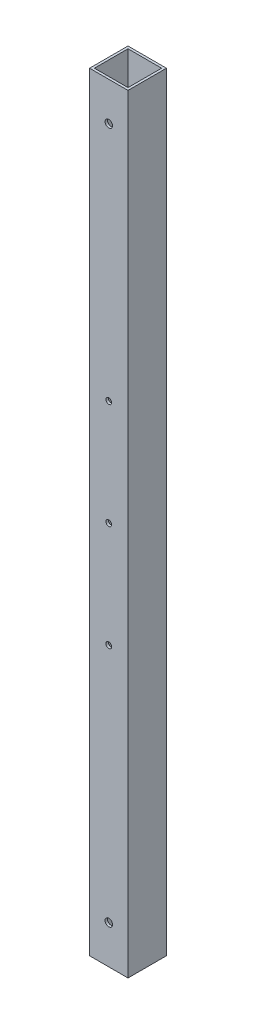
ISO-10303-21;
HEADER;
FILE_DESCRIPTION(('STEP AP214'),'2;1');
FILE_NAME('part.step','',(''),(''),'','','');
FILE_SCHEMA(('AUTOMOTIVE_DESIGN { 1 0 10303 214 1 1 1 1 }'));
ENDSEC;
DATA;
#1=APPLICATION_CONTEXT('core data for automotive mechanical design processes');
#2=APPLICATION_PROTOCOL_DEFINITION('international standard','automotive_design',2000,#1);
#3=PRODUCT_CONTEXT('',#1,'mechanical');
#4=PRODUCT('Part','Part','',(#3));
#5=PRODUCT_RELATED_PRODUCT_CATEGORY('part','',(#4));
#6=PRODUCT_DEFINITION_FORMATION('','',#4);
#7=PRODUCT_DEFINITION_CONTEXT('part definition',#1,'design');
#8=PRODUCT_DEFINITION('design','',#6,#7);
#9=PRODUCT_DEFINITION_SHAPE('','',#8);
#10=(LENGTH_UNIT() NAMED_UNIT(*) SI_UNIT(.MILLI.,.METRE.));
#11=(NAMED_UNIT(*) PLANE_ANGLE_UNIT() SI_UNIT($,.RADIAN.));
#12=(NAMED_UNIT(*) SI_UNIT($,.STERADIAN.) SOLID_ANGLE_UNIT());
#13=UNCERTAINTY_MEASURE_WITH_UNIT(LENGTH_MEASURE(1.E-05),#10,'distance_accuracy_value','');
#14=(GEOMETRIC_REPRESENTATION_CONTEXT(3) GLOBAL_UNCERTAINTY_ASSIGNED_CONTEXT((#13)) GLOBAL_UNIT_ASSIGNED_CONTEXT((#10,
#11,#12)) REPRESENTATION_CONTEXT('',''));
#15=CARTESIAN_POINT('',(0.,0.,0.));
#16=DIRECTION('',(0.,0.,1.));
#17=DIRECTION('',(1.,0.,0.));
#18=AXIS2_PLACEMENT_3D('',#15,#16,#17);
#19=CARTESIAN_POINT('',(0.,254.,0.));
#20=DIRECTION('',(0.,1.,0.));
#21=DIRECTION('',(0.,0.,1.));
#22=AXIS2_PLACEMENT_3D('',#19,#20,#21);
#23=PLANE('',#22);
#24=DIRECTION('',(0.,0.,1.));
#25=VECTOR('',#24,1.);
#26=CARTESIAN_POINT('',(-12.7,254.,12.7));
#27=LINE('',#26,#25);
#28=CARTESIAN_POINT('',(-12.7,254.,-12.7));
#29=VERTEX_POINT('',#28);
#30=CARTESIAN_POINT('',(-12.7,254.,12.7));
#31=VERTEX_POINT('',#30);
#32=EDGE_CURVE('E137',#29,#31,#27,.T.);
#33=ORIENTED_EDGE('',*,*,#32,.T.);
#34=DIRECTION('',(1.,0.,0.));
#35=VECTOR('',#34,1.);
#36=CARTESIAN_POINT('',(12.7,254.,12.7));
#37=LINE('',#36,#35);
#38=CARTESIAN_POINT('',(12.7,254.,12.7));
#39=VERTEX_POINT('',#38);
#40=EDGE_CURVE('E140',#31,#39,#37,.T.);
#41=ORIENTED_EDGE('',*,*,#40,.T.);
#42=DIRECTION('',(0.,0.,-1.));
#43=VECTOR('',#42,1.);
#44=CARTESIAN_POINT('',(12.7,254.,12.7));
#45=LINE('',#44,#43);
#46=CARTESIAN_POINT('',(12.7,254.,-12.7));
#47=VERTEX_POINT('',#46);
#48=EDGE_CURVE('E143',#39,#47,#45,.T.);
#49=ORIENTED_EDGE('',*,*,#48,.T.);
#50=DIRECTION('',(-1.,0.,0.));
#51=VECTOR('',#50,1.);
#52=CARTESIAN_POINT('',(12.7,254.,-12.7));
#53=LINE('',#52,#51);
#54=EDGE_CURVE('E145',#47,#29,#53,.T.);
#55=ORIENTED_EDGE('',*,*,#54,.T.);
#56=EDGE_LOOP('',(#33,#41,#49,#55));
#57=FACE_BOUND('',#56,.T.);
#58=DIRECTION('',(-1.,0.,0.));
#59=VECTOR('',#58,1.);
#60=CARTESIAN_POINT('',(11.1125,254.,-11.1125));
#61=LINE('',#60,#59);
#62=CARTESIAN_POINT('',(11.1125,254.,-11.1125));
#63=VERTEX_POINT('',#62);
#64=CARTESIAN_POINT('',(-11.1125,254.,-11.1125));
#65=VERTEX_POINT('',#64);
#66=EDGE_CURVE('E107',#63,#65,#61,.T.);
#67=ORIENTED_EDGE('',*,*,#66,.F.);
#68=DIRECTION('',(0.,0.,-1.));
#69=VECTOR('',#68,1.);
#70=CARTESIAN_POINT('',(11.1125,254.,11.1125));
#71=LINE('',#70,#69);
#72=CARTESIAN_POINT('',(11.1125,254.,11.1125));
#73=VERTEX_POINT('',#72);
#74=EDGE_CURVE('E99',#73,#63,#71,.T.);
#75=ORIENTED_EDGE('',*,*,#74,.F.);
#76=DIRECTION('',(1.,0.,0.));
#77=VECTOR('',#76,1.);
#78=CARTESIAN_POINT('',(11.1125,254.,11.1125));
#79=LINE('',#78,#77);
#80=CARTESIAN_POINT('',(-11.1125,254.,11.1125));
#81=VERTEX_POINT('',#80);
#82=EDGE_CURVE('E121',#81,#73,#79,.T.);
#83=ORIENTED_EDGE('',*,*,#82,.F.);
#84=DIRECTION('',(0.,0.,1.));
#85=VECTOR('',#84,1.);
#86=CARTESIAN_POINT('',(-11.1125,254.,11.1125));
#87=LINE('',#86,#85);
#88=EDGE_CURVE('E119',#65,#81,#87,.T.);
#89=ORIENTED_EDGE('',*,*,#88,.F.);
#90=EDGE_LOOP('',(#67,#75,#83,#89));
#91=FACE_BOUND('',#90,.T.);
#92=ADVANCED_FACE('F32',(#57,#91),#23,.T.);
#93=CARTESIAN_POINT('',(0.,-254.,0.));
#94=DIRECTION('',(0.,1.,0.));
#95=DIRECTION('',(0.,0.,1.));
#96=AXIS2_PLACEMENT_3D('',#93,#94,#95);
#97=PLANE('',#96);
#98=DIRECTION('',(0.,0.,1.));
#99=VECTOR('',#98,1.);
#100=CARTESIAN_POINT('',(-12.7,-254.,12.7));
#101=LINE('',#100,#99);
#102=CARTESIAN_POINT('',(-12.7,-254.,-12.7));
#103=VERTEX_POINT('',#102);
#104=CARTESIAN_POINT('',(-12.7,-254.,12.7));
#105=VERTEX_POINT('',#104);
#106=EDGE_CURVE('E115',#103,#105,#101,.T.);
#107=ORIENTED_EDGE('',*,*,#106,.F.);
#108=DIRECTION('',(-1.,0.,0.));
#109=VECTOR('',#108,1.);
#110=CARTESIAN_POINT('',(12.7,-254.,-12.7));
#111=LINE('',#110,#109);
#112=CARTESIAN_POINT('',(12.7,-254.,-12.7));
#113=VERTEX_POINT('',#112);
#114=EDGE_CURVE('E141',#113,#103,#111,.T.);
#115=ORIENTED_EDGE('',*,*,#114,.F.);
#116=DIRECTION('',(0.,0.,-1.));
#117=VECTOR('',#116,1.);
#118=CARTESIAN_POINT('',(12.7,-254.,12.7));
#119=LINE('',#118,#117);
#120=CARTESIAN_POINT('',(12.7,-254.,12.7));
#121=VERTEX_POINT('',#120);
#122=EDGE_CURVE('E152',#121,#113,#119,.T.);
#123=ORIENTED_EDGE('',*,*,#122,.F.);
#124=DIRECTION('',(1.,0.,0.));
#125=VECTOR('',#124,1.);
#126=CARTESIAN_POINT('',(12.7,-254.,12.7));
#127=LINE('',#126,#125);
#128=EDGE_CURVE('E150',#105,#121,#127,.T.);
#129=ORIENTED_EDGE('',*,*,#128,.F.);
#130=EDGE_LOOP('',(#107,#115,#123,#129));
#131=FACE_BOUND('',#130,.T.);
#132=DIRECTION('',(0.,0.,-1.));
#133=VECTOR('',#132,1.);
#134=CARTESIAN_POINT('',(11.1125,-254.,11.1125));
#135=LINE('',#134,#133);
#136=CARTESIAN_POINT('',(11.1125,-254.,11.1125));
#137=VERTEX_POINT('',#136);
#138=CARTESIAN_POINT('',(11.1125,-254.,-11.1125));
#139=VERTEX_POINT('',#138);
#140=EDGE_CURVE('E57',#137,#139,#135,.T.);
#141=ORIENTED_EDGE('',*,*,#140,.T.);
#142=DIRECTION('',(-1.,0.,0.));
#143=VECTOR('',#142,1.);
#144=CARTESIAN_POINT('',(11.1125,-254.,-11.1125));
#145=LINE('',#144,#143);
#146=CARTESIAN_POINT('',(-11.1125,-254.,-11.1125));
#147=VERTEX_POINT('',#146);
#148=EDGE_CURVE('E114',#139,#147,#145,.T.);
#149=ORIENTED_EDGE('',*,*,#148,.T.);
#150=DIRECTION('',(0.,0.,1.));
#151=VECTOR('',#150,1.);
#152=CARTESIAN_POINT('',(-11.1125,-254.,11.1125));
#153=LINE('',#152,#151);
#154=CARTESIAN_POINT('',(-11.1125,-254.,11.1125));
#155=VERTEX_POINT('',#154);
#156=EDGE_CURVE('E129',#147,#155,#153,.T.);
#157=ORIENTED_EDGE('',*,*,#156,.T.);
#158=DIRECTION('',(1.,0.,0.));
#159=VECTOR('',#158,1.);
#160=CARTESIAN_POINT('',(11.1125,-254.,11.1125));
#161=LINE('',#160,#159);
#162=EDGE_CURVE('E108',#155,#137,#161,.T.);
#163=ORIENTED_EDGE('',*,*,#162,.T.);
#164=EDGE_LOOP('',(#141,#149,#157,#163));
#165=FACE_BOUND('',#164,.T.);
#166=ADVANCED_FACE('F236',(#131,#165),#97,.F.);
#167=CARTESIAN_POINT('',(-12.7,254.,12.7));
#168=DIRECTION('',(1.,0.,0.));
#169=DIRECTION('',(0.,0.,-1.));
#170=AXIS2_PLACEMENT_3D('',#167,#168,#169);
#171=PLANE('',#170);
#172=ORIENTED_EDGE('',*,*,#106,.T.);
#173=DIRECTION('',(0.,-1.,0.));
#174=VECTOR('',#173,1.);
#175=CARTESIAN_POINT('',(-12.7,254.,12.7));
#176=LINE('',#175,#174);
#177=EDGE_CURVE('E11',#31,#105,#176,.T.);
#178=ORIENTED_EDGE('',*,*,#177,.F.);
#179=ORIENTED_EDGE('',*,*,#32,.F.);
#180=DIRECTION('',(0.,-1.,0.));
#181=VECTOR('',#180,1.);
#182=CARTESIAN_POINT('',(-12.7,254.,-12.7));
#183=LINE('',#182,#181);
#184=EDGE_CURVE('E147',#29,#103,#183,.T.);
#185=ORIENTED_EDGE('',*,*,#184,.T.);
#186=EDGE_LOOP('',(#172,#178,#179,#185));
#187=FACE_BOUND('',#186,.T.);
#188=ADVANCED_FACE('F34',(#187),#171,.F.);
#189=CARTESIAN_POINT('',(12.7,254.,12.7));
#190=DIRECTION('',(0.,0.,-1.));
#191=DIRECTION('',(-1.,0.,0.));
#192=AXIS2_PLACEMENT_3D('',#189,#190,#191);
#193=PLANE('',#192);
#194=CARTESIAN_POINT('',(-4.84811459262744E-13,69.85,12.7));
#195=DIRECTION('',(0.,0.,1.));
#196=DIRECTION('',(1.,0.,0.));
#197=AXIS2_PLACEMENT_3D('',#194,#195,#196);
#198=CIRCLE('',#197,1.90499999999999);
#199=CARTESIAN_POINT('',(1.90499999999951,69.85,12.7));
#200=VERTEX_POINT('',#199);
#201=EDGE_CURVE('E264',#200,#200,#198,.T.);
#202=ORIENTED_EDGE('',*,*,#201,.F.);
#203=EDGE_LOOP('',(#202));
#204=FACE_BOUND('',#203,.T.);
#205=CARTESIAN_POINT('',(-2.40931487744551E-13,0.,12.7));
#206=DIRECTION('',(0.,0.,1.));
#207=DIRECTION('',(1.,0.,0.));
#208=AXIS2_PLACEMENT_3D('',#205,#206,#207);
#209=CIRCLE('',#208,1.90499999999999);
#210=CARTESIAN_POINT('',(1.90499999999975,0.,12.7));
#211=VERTEX_POINT('',#210);
#212=EDGE_CURVE('E186',#211,#211,#209,.T.);
#213=ORIENTED_EDGE('',*,*,#212,.F.);
#214=EDGE_LOOP('',(#213));
#215=FACE_BOUND('',#214,.T.);
#216=CARTESIAN_POINT('',(0.,-69.85,12.7));
#217=DIRECTION('',(0.,0.,1.));
#218=DIRECTION('',(1.,0.,0.));
#219=AXIS2_PLACEMENT_3D('',#216,#217,#218);
#220=CIRCLE('',#219,1.90499999999999);
#221=CARTESIAN_POINT('',(1.905,-69.85,12.7));
#222=VERTEX_POINT('',#221);
#223=EDGE_CURVE('E183',#222,#222,#220,.T.);
#224=ORIENTED_EDGE('',*,*,#223,.F.);
#225=EDGE_LOOP('',(#224));
#226=FACE_BOUND('',#225,.T.);
#227=CARTESIAN_POINT('',(0.,228.6,12.7));
#228=DIRECTION('',(0.,0.,-1.));
#229=DIRECTION('',(-1.,0.,0.));
#230=AXIS2_PLACEMENT_3D('',#227,#228,#229);
#231=CIRCLE('',#230,2.45744999999999);
#232=CARTESIAN_POINT('',(-2.45744999999999,228.6,12.7));
#233=VERTEX_POINT('',#232);
#234=EDGE_CURVE('E206',#233,#233,#231,.T.);
#235=ORIENTED_EDGE('',*,*,#234,.T.);
#236=EDGE_LOOP('',(#235));
#237=FACE_BOUND('',#236,.T.);
#238=CARTESIAN_POINT('',(0.,-228.6,12.7));
#239=DIRECTION('',(0.,0.,-1.));
#240=DIRECTION('',(-1.,0.,0.));
#241=AXIS2_PLACEMENT_3D('',#238,#239,#240);
#242=CIRCLE('',#241,2.45744999999999);
#243=CARTESIAN_POINT('',(-2.45744999999999,-228.6,12.7));
#244=VERTEX_POINT('',#243);
#245=EDGE_CURVE('E127',#244,#244,#242,.T.);
#246=ORIENTED_EDGE('',*,*,#245,.T.);
#247=EDGE_LOOP('',(#246));
#248=FACE_BOUND('',#247,.T.);
#249=ORIENTED_EDGE('',*,*,#128,.T.);
#250=DIRECTION('',(0.,-1.,0.));
#251=VECTOR('',#250,1.);
#252=CARTESIAN_POINT('',(12.7,254.,12.7));
#253=LINE('',#252,#251);
#254=EDGE_CURVE('E41',#39,#121,#253,.T.);
#255=ORIENTED_EDGE('',*,*,#254,.F.);
#256=ORIENTED_EDGE('',*,*,#40,.F.);
#257=ORIENTED_EDGE('',*,*,#177,.T.);
#258=EDGE_LOOP('',(#249,#255,#256,#257));
#259=FACE_BOUND('',#258,.T.);
#260=ADVANCED_FACE('F215',(#204,#215,#226,#237,#248,#259),#193,.F.);
#261=CARTESIAN_POINT('',(12.7,254.,12.7));
#262=DIRECTION('',(-1.,0.,0.));
#263=DIRECTION('',(0.,0.,1.));
#264=AXIS2_PLACEMENT_3D('',#261,#262,#263);
#265=PLANE('',#264);
#266=ORIENTED_EDGE('',*,*,#122,.T.);
#267=DIRECTION('',(0.,-1.,0.));
#268=VECTOR('',#267,1.);
#269=CARTESIAN_POINT('',(12.7,254.,-12.7));
#270=LINE('',#269,#268);
#271=EDGE_CURVE('E157',#47,#113,#270,.T.);
#272=ORIENTED_EDGE('',*,*,#271,.F.);
#273=ORIENTED_EDGE('',*,*,#48,.F.);
#274=ORIENTED_EDGE('',*,*,#254,.T.);
#275=EDGE_LOOP('',(#266,#272,#273,#274));
#276=FACE_BOUND('',#275,.T.);
#277=ADVANCED_FACE('F250',(#276),#265,.F.);
#278=CARTESIAN_POINT('',(12.7,254.,-12.7));
#279=DIRECTION('',(0.,0.,1.));
#280=DIRECTION('',(1.,0.,0.));
#281=AXIS2_PLACEMENT_3D('',#278,#279,#280);
#282=PLANE('',#281);
#283=CARTESIAN_POINT('',(-4.84811459262744E-13,69.85,-12.7));
#284=DIRECTION('',(0.,0.,1.));
#285=DIRECTION('',(1.,0.,0.));
#286=AXIS2_PLACEMENT_3D('',#283,#284,#285);
#287=CIRCLE('',#286,1.90499999999999);
#288=CARTESIAN_POINT('',(1.90499999999951,69.85,-12.7));
#289=VERTEX_POINT('',#288);
#290=EDGE_CURVE('E301',#289,#289,#287,.T.);
#291=ORIENTED_EDGE('',*,*,#290,.T.);
#292=EDGE_LOOP('',(#291));
#293=FACE_BOUND('',#292,.T.);
#294=CARTESIAN_POINT('',(-2.40931487744551E-13,0.,-12.7));
#295=DIRECTION('',(0.,0.,1.));
#296=DIRECTION('',(1.,0.,0.));
#297=AXIS2_PLACEMENT_3D('',#294,#295,#296);
#298=CIRCLE('',#297,1.90499999999999);
#299=CARTESIAN_POINT('',(1.90499999999975,0.,-12.7));
#300=VERTEX_POINT('',#299);
#301=EDGE_CURVE('E179',#300,#300,#298,.T.);
#302=ORIENTED_EDGE('',*,*,#301,.T.);
#303=EDGE_LOOP('',(#302));
#304=FACE_BOUND('',#303,.T.);
#305=CARTESIAN_POINT('',(0.,-69.85,-12.7));
#306=DIRECTION('',(0.,0.,1.));
#307=DIRECTION('',(1.,0.,0.));
#308=AXIS2_PLACEMENT_3D('',#305,#306,#307);
#309=CIRCLE('',#308,1.90499999999999);
#310=CARTESIAN_POINT('',(1.905,-69.85,-12.7));
#311=VERTEX_POINT('',#310);
#312=EDGE_CURVE('E175',#311,#311,#309,.T.);
#313=ORIENTED_EDGE('',*,*,#312,.T.);
#314=EDGE_LOOP('',(#313));
#315=FACE_BOUND('',#314,.T.);
#316=CARTESIAN_POINT('',(0.,228.6,-12.7));
#317=DIRECTION('',(0.,0.,-1.));
#318=DIRECTION('',(-1.,0.,0.));
#319=AXIS2_PLACEMENT_3D('',#316,#317,#318);
#320=CIRCLE('',#319,2.45744999999999);
#321=CARTESIAN_POINT('',(-2.45744999999999,228.6,-12.7));
#322=VERTEX_POINT('',#321);
#323=EDGE_CURVE('E171',#322,#322,#320,.T.);
#324=ORIENTED_EDGE('',*,*,#323,.F.);
#325=EDGE_LOOP('',(#324));
#326=FACE_BOUND('',#325,.T.);
#327=CARTESIAN_POINT('',(0.,-228.6,-12.7));
#328=DIRECTION('',(0.,0.,-1.));
#329=DIRECTION('',(-1.,0.,0.));
#330=AXIS2_PLACEMENT_3D('',#327,#328,#329);
#331=CIRCLE('',#330,2.45744999999999);
#332=CARTESIAN_POINT('',(-2.45744999999999,-228.6,-12.7));
#333=VERTEX_POINT('',#332);
#334=EDGE_CURVE('E166',#333,#333,#331,.T.);
#335=ORIENTED_EDGE('',*,*,#334,.F.);
#336=EDGE_LOOP('',(#335));
#337=FACE_BOUND('',#336,.T.);
#338=ORIENTED_EDGE('',*,*,#114,.T.);
#339=ORIENTED_EDGE('',*,*,#184,.F.);
#340=ORIENTED_EDGE('',*,*,#54,.F.);
#341=ORIENTED_EDGE('',*,*,#271,.T.);
#342=EDGE_LOOP('',(#338,#339,#340,#341));
#343=FACE_BOUND('',#342,.T.);
#344=ADVANCED_FACE('F247',(#293,#304,#315,#326,#337,#343),#282,.F.);
#345=CARTESIAN_POINT('',(11.1125,254.,11.1125));
#346=DIRECTION('',(-1.,0.,0.));
#347=DIRECTION('',(0.,0.,1.));
#348=AXIS2_PLACEMENT_3D('',#345,#346,#347);
#349=PLANE('',#348);
#350=ORIENTED_EDGE('',*,*,#140,.F.);
#351=DIRECTION('',(0.,-1.,0.));
#352=VECTOR('',#351,1.);
#353=CARTESIAN_POINT('',(11.1125,254.,11.1125));
#354=LINE('',#353,#352);
#355=EDGE_CURVE('E103',#73,#137,#354,.T.);
#356=ORIENTED_EDGE('',*,*,#355,.F.);
#357=ORIENTED_EDGE('',*,*,#74,.T.);
#358=DIRECTION('',(0.,-1.,0.));
#359=VECTOR('',#358,1.);
#360=CARTESIAN_POINT('',(11.1125,254.,-11.1125));
#361=LINE('',#360,#359);
#362=EDGE_CURVE('E102',#63,#139,#361,.T.);
#363=ORIENTED_EDGE('',*,*,#362,.T.);
#364=EDGE_LOOP('',(#350,#356,#357,#363));
#365=FACE_BOUND('',#364,.T.);
#366=ADVANCED_FACE('F101',(#365),#349,.T.);
#367=CARTESIAN_POINT('',(11.1125,254.,-11.1125));
#368=DIRECTION('',(0.,0.,1.));
#369=DIRECTION('',(1.,0.,0.));
#370=AXIS2_PLACEMENT_3D('',#367,#368,#369);
#371=PLANE('',#370);
#372=CARTESIAN_POINT('',(-4.84811459262744E-13,69.85,-11.1125));
#373=DIRECTION('',(0.,0.,1.));
#374=DIRECTION('',(1.,0.,0.));
#375=AXIS2_PLACEMENT_3D('',#372,#373,#374);
#376=CIRCLE('',#375,1.90499999999999);
#377=CARTESIAN_POINT('',(1.90499999999951,69.85,-11.1125));
#378=VERTEX_POINT('',#377);
#379=EDGE_CURVE('E191',#378,#378,#376,.T.);
#380=ORIENTED_EDGE('',*,*,#379,.F.);
#381=EDGE_LOOP('',(#380));
#382=FACE_BOUND('',#381,.T.);
#383=CARTESIAN_POINT('',(-2.40931487744551E-13,0.,-11.1125));
#384=DIRECTION('',(0.,0.,1.));
#385=DIRECTION('',(1.,0.,0.));
#386=AXIS2_PLACEMENT_3D('',#383,#384,#385);
#387=CIRCLE('',#386,1.90499999999999);
#388=CARTESIAN_POINT('',(1.90499999999975,0.,-11.1125));
#389=VERTEX_POINT('',#388);
#390=EDGE_CURVE('E178',#389,#389,#387,.T.);
#391=ORIENTED_EDGE('',*,*,#390,.F.);
#392=EDGE_LOOP('',(#391));
#393=FACE_BOUND('',#392,.T.);
#394=CARTESIAN_POINT('',(0.,-69.85,-11.1125));
#395=DIRECTION('',(0.,0.,1.));
#396=DIRECTION('',(1.,0.,0.));
#397=AXIS2_PLACEMENT_3D('',#394,#395,#396);
#398=CIRCLE('',#397,1.90499999999999);
#399=CARTESIAN_POINT('',(1.905,-69.85,-11.1125));
#400=VERTEX_POINT('',#399);
#401=EDGE_CURVE('E174',#400,#400,#398,.T.);
#402=ORIENTED_EDGE('',*,*,#401,.F.);
#403=EDGE_LOOP('',(#402));
#404=FACE_BOUND('',#403,.T.);
#405=CARTESIAN_POINT('',(0.,228.6,-11.1125));
#406=DIRECTION('',(0.,0.,1.));
#407=DIRECTION('',(1.,0.,0.));
#408=AXIS2_PLACEMENT_3D('',#405,#406,#407);
#409=CIRCLE('',#408,2.45744999999999);
#410=CARTESIAN_POINT('',(2.45744999999999,228.6,-11.1125));
#411=VERTEX_POINT('',#410);
#412=EDGE_CURVE('E170',#411,#411,#409,.T.);
#413=ORIENTED_EDGE('',*,*,#412,.F.);
#414=EDGE_LOOP('',(#413));
#415=FACE_BOUND('',#414,.T.);
#416=CARTESIAN_POINT('',(0.,-228.6,-11.1125));
#417=DIRECTION('',(0.,0.,1.));
#418=DIRECTION('',(1.,0.,0.));
#419=AXIS2_PLACEMENT_3D('',#416,#417,#418);
#420=CIRCLE('',#419,2.45744999999999);
#421=CARTESIAN_POINT('',(2.45744999999999,-228.6,-11.1125));
#422=VERTEX_POINT('',#421);
#423=EDGE_CURVE('E165',#422,#422,#420,.T.);
#424=ORIENTED_EDGE('',*,*,#423,.F.);
#425=EDGE_LOOP('',(#424));
#426=FACE_BOUND('',#425,.T.);
#427=ORIENTED_EDGE('',*,*,#148,.F.);
#428=ORIENTED_EDGE('',*,*,#362,.F.);
#429=ORIENTED_EDGE('',*,*,#66,.T.);
#430=DIRECTION('',(0.,-1.,0.));
#431=VECTOR('',#430,1.);
#432=CARTESIAN_POINT('',(-11.1125,254.,-11.1125));
#433=LINE('',#432,#431);
#434=EDGE_CURVE('E116',#65,#147,#433,.T.);
#435=ORIENTED_EDGE('',*,*,#434,.T.);
#436=EDGE_LOOP('',(#427,#428,#429,#435));
#437=FACE_BOUND('',#436,.T.);
#438=ADVANCED_FACE('F111',(#382,#393,#404,#415,#426,#437),#371,.T.);
#439=CARTESIAN_POINT('',(-11.1125,254.,11.1125));
#440=DIRECTION('',(1.,0.,0.));
#441=DIRECTION('',(0.,0.,-1.));
#442=AXIS2_PLACEMENT_3D('',#439,#440,#441);
#443=PLANE('',#442);
#444=ORIENTED_EDGE('',*,*,#156,.F.);
#445=ORIENTED_EDGE('',*,*,#434,.F.);
#446=ORIENTED_EDGE('',*,*,#88,.T.);
#447=DIRECTION('',(0.,-1.,0.));
#448=VECTOR('',#447,1.);
#449=CARTESIAN_POINT('',(-11.1125,254.,11.1125));
#450=LINE('',#449,#448);
#451=EDGE_CURVE('E49',#81,#155,#450,.T.);
#452=ORIENTED_EDGE('',*,*,#451,.T.);
#453=EDGE_LOOP('',(#444,#445,#446,#452));
#454=FACE_BOUND('',#453,.T.);
#455=ADVANCED_FACE('F231',(#454),#443,.T.);
#456=CARTESIAN_POINT('',(11.1125,254.,11.1125));
#457=DIRECTION('',(0.,0.,-1.));
#458=DIRECTION('',(-1.,0.,0.));
#459=AXIS2_PLACEMENT_3D('',#456,#457,#458);
#460=PLANE('',#459);
#461=CARTESIAN_POINT('',(-4.84811459262744E-13,69.85,11.1125));
#462=DIRECTION('',(0.,0.,-1.));
#463=DIRECTION('',(-1.,0.,0.));
#464=AXIS2_PLACEMENT_3D('',#461,#462,#463);
#465=CIRCLE('',#464,1.90499999999999);
#466=CARTESIAN_POINT('',(-1.90500000000048,69.85,11.1125));
#467=VERTEX_POINT('',#466);
#468=EDGE_CURVE('E36',#467,#467,#465,.T.);
#469=ORIENTED_EDGE('',*,*,#468,.F.);
#470=EDGE_LOOP('',(#469));
#471=FACE_BOUND('',#470,.T.);
#472=CARTESIAN_POINT('',(-2.40931487744551E-13,0.,11.1125));
#473=DIRECTION('',(0.,0.,-1.));
#474=DIRECTION('',(-1.,0.,0.));
#475=AXIS2_PLACEMENT_3D('',#472,#473,#474);
#476=CIRCLE('',#475,1.90499999999999);
#477=CARTESIAN_POINT('',(-1.90500000000024,0.,11.1125));
#478=VERTEX_POINT('',#477);
#479=EDGE_CURVE('E176',#478,#478,#476,.T.);
#480=ORIENTED_EDGE('',*,*,#479,.F.);
#481=EDGE_LOOP('',(#480));
#482=FACE_BOUND('',#481,.T.);
#483=CARTESIAN_POINT('',(0.,-69.85,11.1125));
#484=DIRECTION('',(0.,0.,-1.));
#485=DIRECTION('',(-1.,0.,0.));
#486=AXIS2_PLACEMENT_3D('',#483,#484,#485);
#487=CIRCLE('',#486,1.90499999999999);
#488=CARTESIAN_POINT('',(-1.90499999999999,-69.85,11.1125));
#489=VERTEX_POINT('',#488);
#490=EDGE_CURVE('E172',#489,#489,#487,.T.);
#491=ORIENTED_EDGE('',*,*,#490,.F.);
#492=EDGE_LOOP('',(#491));
#493=FACE_BOUND('',#492,.T.);
#494=CARTESIAN_POINT('',(0.,228.6,11.1125));
#495=DIRECTION('',(0.,0.,-1.));
#496=DIRECTION('',(-1.,0.,0.));
#497=AXIS2_PLACEMENT_3D('',#494,#495,#496);
#498=CIRCLE('',#497,2.45744999999999);
#499=CARTESIAN_POINT('',(-2.45744999999999,228.6,11.1125));
#500=VERTEX_POINT('',#499);
#501=EDGE_CURVE('E167',#500,#500,#498,.T.);
#502=ORIENTED_EDGE('',*,*,#501,.F.);
#503=EDGE_LOOP('',(#502));
#504=FACE_BOUND('',#503,.T.);
#505=CARTESIAN_POINT('',(0.,-228.6,11.1125));
#506=DIRECTION('',(0.,0.,-1.));
#507=DIRECTION('',(-1.,0.,0.));
#508=AXIS2_PLACEMENT_3D('',#505,#506,#507);
#509=CIRCLE('',#508,2.45744999999999);
#510=CARTESIAN_POINT('',(-2.45744999999999,-228.6,11.1125));
#511=VERTEX_POINT('',#510);
#512=EDGE_CURVE('E162',#511,#511,#509,.T.);
#513=ORIENTED_EDGE('',*,*,#512,.F.);
#514=EDGE_LOOP('',(#513));
#515=FACE_BOUND('',#514,.T.);
#516=ORIENTED_EDGE('',*,*,#162,.F.);
#517=ORIENTED_EDGE('',*,*,#451,.F.);
#518=ORIENTED_EDGE('',*,*,#82,.T.);
#519=ORIENTED_EDGE('',*,*,#355,.T.);
#520=EDGE_LOOP('',(#516,#517,#518,#519));
#521=FACE_BOUND('',#520,.T.);
#522=ADVANCED_FACE('F221',(#471,#482,#493,#504,#515,#521),#460,.T.);
#523=CARTESIAN_POINT('',(0.,-228.6,-12.7));
#524=DIRECTION('',(0.,0.,-1.));
#525=DIRECTION('',(-1.,0.,0.));
#526=AXIS2_PLACEMENT_3D('',#523,#524,#525);
#527=CYLINDRICAL_SURFACE('',#526,2.45744999999999);
#528=ORIENTED_EDGE('',*,*,#512,.T.);
#529=EDGE_LOOP('',(#528));
#530=FACE_BOUND('',#529,.T.);
#531=ORIENTED_EDGE('',*,*,#245,.F.);
#532=EDGE_LOOP('',(#531));
#533=FACE_BOUND('',#532,.T.);
#534=ADVANCED_FACE('F218',(#530,#533),#527,.F.);
#535=ORIENTED_EDGE('',*,*,#423,.T.);
#536=EDGE_LOOP('',(#535));
#537=FACE_BOUND('',#536,.T.);
#538=ORIENTED_EDGE('',*,*,#334,.T.);
#539=EDGE_LOOP('',(#538));
#540=FACE_BOUND('',#539,.T.);
#541=ADVANCED_FACE('F220',(#537,#540),#527,.F.);
#542=CARTESIAN_POINT('',(0.,228.6,-12.7));
#543=DIRECTION('',(0.,0.,-1.));
#544=DIRECTION('',(-1.,0.,0.));
#545=AXIS2_PLACEMENT_3D('',#542,#543,#544);
#546=CYLINDRICAL_SURFACE('',#545,2.45744999999999);
#547=ORIENTED_EDGE('',*,*,#501,.T.);
#548=EDGE_LOOP('',(#547));
#549=FACE_BOUND('',#548,.T.);
#550=ORIENTED_EDGE('',*,*,#234,.F.);
#551=EDGE_LOOP('',(#550));
#552=FACE_BOUND('',#551,.T.);
#553=ADVANCED_FACE('F228',(#549,#552),#546,.F.);
#554=ORIENTED_EDGE('',*,*,#412,.T.);
#555=EDGE_LOOP('',(#554));
#556=FACE_BOUND('',#555,.T.);
#557=ORIENTED_EDGE('',*,*,#323,.T.);
#558=EDGE_LOOP('',(#557));
#559=FACE_BOUND('',#558,.T.);
#560=ADVANCED_FACE('F272',(#556,#559),#546,.F.);
#561=CARTESIAN_POINT('',(0.,-69.85,-12.7));
#562=DIRECTION('',(0.,0.,1.));
#563=DIRECTION('',(1.,0.,0.));
#564=AXIS2_PLACEMENT_3D('',#561,#562,#563);
#565=CYLINDRICAL_SURFACE('',#564,1.90499999999999);
#566=ORIENTED_EDGE('',*,*,#490,.T.);
#567=EDGE_LOOP('',(#566));
#568=FACE_BOUND('',#567,.T.);
#569=ORIENTED_EDGE('',*,*,#223,.T.);
#570=EDGE_LOOP('',(#569));
#571=FACE_BOUND('',#570,.T.);
#572=ADVANCED_FACE('F277',(#568,#571),#565,.F.);
#573=ORIENTED_EDGE('',*,*,#401,.T.);
#574=EDGE_LOOP('',(#573));
#575=FACE_BOUND('',#574,.T.);
#576=ORIENTED_EDGE('',*,*,#312,.F.);
#577=EDGE_LOOP('',(#576));
#578=FACE_BOUND('',#577,.T.);
#579=ADVANCED_FACE('F282',(#575,#578),#565,.F.);
#580=CARTESIAN_POINT('',(-2.40931487744551E-13,0.,-12.7));
#581=DIRECTION('',(0.,0.,1.));
#582=DIRECTION('',(1.,0.,0.));
#583=AXIS2_PLACEMENT_3D('',#580,#581,#582);
#584=CYLINDRICAL_SURFACE('',#583,1.90499999999999);
#585=ORIENTED_EDGE('',*,*,#479,.T.);
#586=EDGE_LOOP('',(#585));
#587=FACE_BOUND('',#586,.T.);
#588=ORIENTED_EDGE('',*,*,#212,.T.);
#589=EDGE_LOOP('',(#588));
#590=FACE_BOUND('',#589,.T.);
#591=ADVANCED_FACE('F284',(#587,#590),#584,.F.);
#592=ORIENTED_EDGE('',*,*,#390,.T.);
#593=EDGE_LOOP('',(#592));
#594=FACE_BOUND('',#593,.T.);
#595=ORIENTED_EDGE('',*,*,#301,.F.);
#596=EDGE_LOOP('',(#595));
#597=FACE_BOUND('',#596,.T.);
#598=ADVANCED_FACE('F287',(#594,#597),#584,.F.);
#599=CARTESIAN_POINT('',(-4.84811459262744E-13,69.85,-12.7));
#600=DIRECTION('',(0.,0.,1.));
#601=DIRECTION('',(1.,0.,0.));
#602=AXIS2_PLACEMENT_3D('',#599,#600,#601);
#603=CYLINDRICAL_SURFACE('',#602,1.90499999999999);
#604=ORIENTED_EDGE('',*,*,#468,.T.);
#605=EDGE_LOOP('',(#604));
#606=FACE_BOUND('',#605,.T.);
#607=ORIENTED_EDGE('',*,*,#201,.T.);
#608=EDGE_LOOP('',(#607));
#609=FACE_BOUND('',#608,.T.);
#610=ADVANCED_FACE('F288',(#606,#609),#603,.F.);
#611=ORIENTED_EDGE('',*,*,#379,.T.);
#612=EDGE_LOOP('',(#611));
#613=FACE_BOUND('',#612,.T.);
#614=ORIENTED_EDGE('',*,*,#290,.F.);
#615=EDGE_LOOP('',(#614));
#616=FACE_BOUND('',#615,.T.);
#617=ADVANCED_FACE('F290',(#613,#616),#603,.F.);
#618=CLOSED_SHELL('',(#92,#166,#188,#260,#277,#344,#366,#438,#455,#522,#534,#541,#553,#560,#572,
#579,#591,#598,#610,#617));
#619=MANIFOLD_SOLID_BREP('B2',#618);
#620=ADVANCED_BREP_SHAPE_REPRESENTATION('',(#18,#619),#14);
#621=SHAPE_DEFINITION_REPRESENTATION(#9,#620);
ENDSEC;
END-ISO-10303-21;
